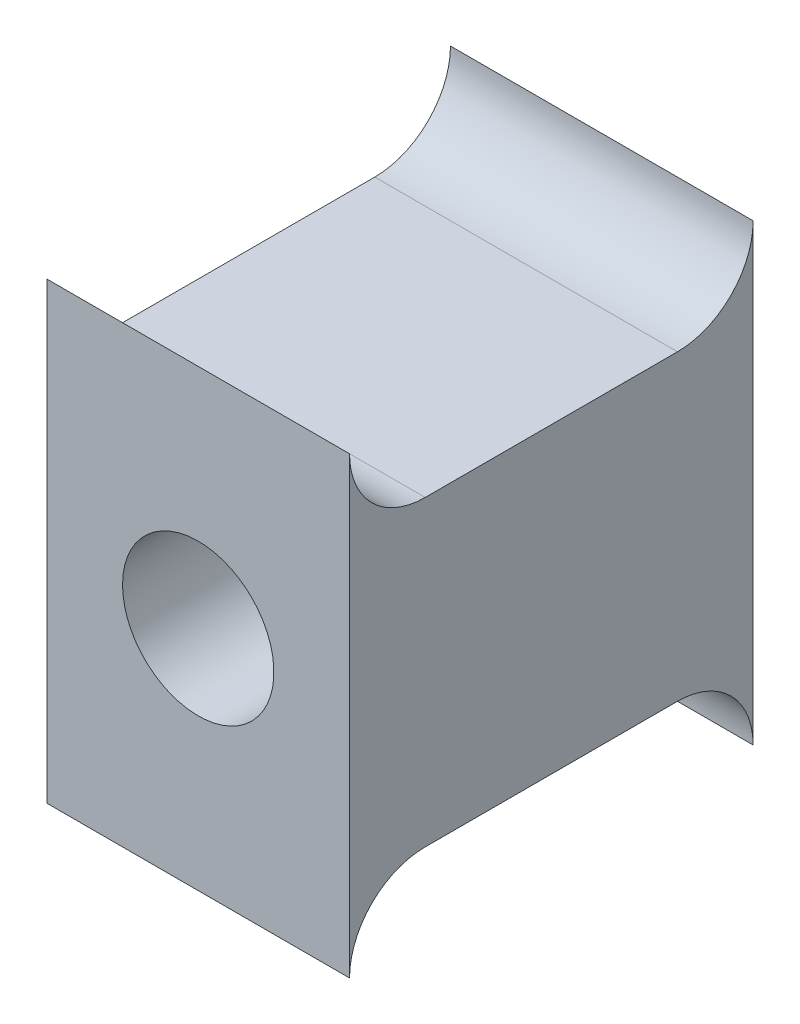
ISO-10303-21;
HEADER;
FILE_DESCRIPTION(('STEP AP214'),'2;1');
FILE_NAME('part.step','',(''),(''),'','','');
FILE_SCHEMA(('AUTOMOTIVE_DESIGN { 1 0 10303 214 1 1 1 1 }'));
ENDSEC;
DATA;
#1=APPLICATION_CONTEXT('core data for automotive mechanical design processes');
#2=APPLICATION_PROTOCOL_DEFINITION('international standard','automotive_design',2000,#1);
#3=PRODUCT_CONTEXT('',#1,'mechanical');
#4=PRODUCT('Part','Part','',(#3));
#5=PRODUCT_RELATED_PRODUCT_CATEGORY('part','',(#4));
#6=PRODUCT_DEFINITION_FORMATION('','',#4);
#7=PRODUCT_DEFINITION_CONTEXT('part definition',#1,'design');
#8=PRODUCT_DEFINITION('design','',#6,#7);
#9=PRODUCT_DEFINITION_SHAPE('','',#8);
#10=(LENGTH_UNIT() NAMED_UNIT(*) SI_UNIT(.MILLI.,.METRE.));
#11=(NAMED_UNIT(*) PLANE_ANGLE_UNIT() SI_UNIT($,.RADIAN.));
#12=(NAMED_UNIT(*) SI_UNIT($,.STERADIAN.) SOLID_ANGLE_UNIT());
#13=UNCERTAINTY_MEASURE_WITH_UNIT(LENGTH_MEASURE(1.E-05),#10,'distance_accuracy_value','');
#14=(GEOMETRIC_REPRESENTATION_CONTEXT(3) GLOBAL_UNCERTAINTY_ASSIGNED_CONTEXT((#13)) GLOBAL_UNIT_ASSIGNED_CONTEXT((#10,
#11,#12)) REPRESENTATION_CONTEXT('',''));
#15=CARTESIAN_POINT('',(0.,0.,0.));
#16=DIRECTION('',(0.,0.,1.));
#17=DIRECTION('',(1.,0.,0.));
#18=AXIS2_PLACEMENT_3D('',#15,#16,#17);
#19=CARTESIAN_POINT('',(12.7,-12.7,16.93418));
#20=DIRECTION('',(-1.,0.,0.));
#21=DIRECTION('',(0.,0.,1.));
#22=AXIS2_PLACEMENT_3D('',#19,#20,#21);
#23=PLANE('',#22);
#24=CARTESIAN_POINT('',(12.7,-19.05,-10.58418));
#25=DIRECTION('',(-1.,0.,0.));
#26=DIRECTION('',(0.,0.,1.));
#27=AXIS2_PLACEMENT_3D('',#24,#25,#26);
#28=CIRCLE('',#27,6.35);
#29=CARTESIAN_POINT('',(12.7,-12.7,-10.58418));
#30=VERTEX_POINT('',#29);
#31=CARTESIAN_POINT('',(12.7,-19.05,-16.93418));
#32=VERTEX_POINT('',#31);
#33=EDGE_CURVE('E121',#30,#32,#28,.T.);
#34=ORIENTED_EDGE('',*,*,#33,.T.);
#35=DIRECTION('',(0.,-1.,0.));
#36=VECTOR('',#35,1.);
#37=CARTESIAN_POINT('',(12.7,-12.7,-16.93418));
#38=LINE('',#37,#36);
#39=CARTESIAN_POINT('',(12.7,19.05,-16.93418));
#40=VERTEX_POINT('',#39);
#41=EDGE_CURVE('E100',#40,#32,#38,.T.);
#42=ORIENTED_EDGE('',*,*,#41,.F.);
#43=CARTESIAN_POINT('',(12.7,19.05,-10.58418));
#44=DIRECTION('',(-1.,0.,0.));
#45=DIRECTION('',(0.,0.,1.));
#46=AXIS2_PLACEMENT_3D('',#43,#44,#45);
#47=CIRCLE('',#46,6.35);
#48=CARTESIAN_POINT('',(12.7,12.7,-10.58418));
#49=VERTEX_POINT('',#48);
#50=EDGE_CURVE('E11',#40,#49,#47,.T.);
#51=ORIENTED_EDGE('',*,*,#50,.T.);
#52=DIRECTION('',(0.,0.,-1.));
#53=VECTOR('',#52,1.);
#54=CARTESIAN_POINT('',(12.7,12.7,16.93418));
#55=LINE('',#54,#53);
#56=CARTESIAN_POINT('',(12.7,12.7,10.58418));
#57=VERTEX_POINT('',#56);
#58=EDGE_CURVE('E139',#57,#49,#55,.T.);
#59=ORIENTED_EDGE('',*,*,#58,.F.);
#60=CARTESIAN_POINT('',(12.7,19.05,10.58418));
#61=DIRECTION('',(-1.,0.,0.));
#62=DIRECTION('',(0.,0.,1.));
#63=AXIS2_PLACEMENT_3D('',#60,#61,#62);
#64=CIRCLE('',#63,6.35);
#65=CARTESIAN_POINT('',(12.7,19.05,16.93418));
#66=VERTEX_POINT('',#65);
#67=EDGE_CURVE('E132',#57,#66,#64,.T.);
#68=ORIENTED_EDGE('',*,*,#67,.T.);
#69=DIRECTION('',(0.,1.,0.));
#70=VECTOR('',#69,1.);
#71=CARTESIAN_POINT('',(12.7,12.7,16.93418));
#72=LINE('',#71,#70);
#73=CARTESIAN_POINT('',(12.7,-19.05,16.93418));
#74=VERTEX_POINT('',#73);
#75=EDGE_CURVE('E137',#74,#66,#72,.T.);
#76=ORIENTED_EDGE('',*,*,#75,.F.);
#77=CARTESIAN_POINT('',(12.7,-19.05,10.58418));
#78=DIRECTION('',(-1.,0.,0.));
#79=DIRECTION('',(0.,0.,1.));
#80=AXIS2_PLACEMENT_3D('',#77,#78,#79);
#81=CIRCLE('',#80,6.35);
#82=CARTESIAN_POINT('',(12.7,-12.7,10.58418));
#83=VERTEX_POINT('',#82);
#84=EDGE_CURVE('E120',#74,#83,#81,.T.);
#85=ORIENTED_EDGE('',*,*,#84,.T.);
#86=DIRECTION('',(0.,0.,-1.));
#87=VECTOR('',#86,1.);
#88=CARTESIAN_POINT('',(12.7,-12.7,16.93418));
#89=LINE('',#88,#87);
#90=EDGE_CURVE('E148',#83,#30,#89,.T.);
#91=ORIENTED_EDGE('',*,*,#90,.T.);
#92=EDGE_LOOP('',(#34,#42,#51,#59,#68,#76,#85,#91));
#93=FACE_BOUND('',#92,.T.);
#94=ADVANCED_FACE('F31',(#93),#23,.F.);
#95=CARTESIAN_POINT('',(12.7,12.7,16.93418));
#96=DIRECTION('',(0.,-1.,0.));
#97=DIRECTION('',(0.,0.,-1.));
#98=AXIS2_PLACEMENT_3D('',#95,#96,#97);
#99=PLANE('',#98);
#100=DIRECTION('',(0.,0.,-1.));
#101=VECTOR('',#100,1.);
#102=CARTESIAN_POINT('',(-12.7,12.7,16.93418));
#103=LINE('',#102,#101);
#104=CARTESIAN_POINT('',(-12.7,12.7,10.58418));
#105=VERTEX_POINT('',#104);
#106=CARTESIAN_POINT('',(-12.7,12.7,-10.58418));
#107=VERTEX_POINT('',#106);
#108=EDGE_CURVE('E163',#105,#107,#103,.T.);
#109=ORIENTED_EDGE('',*,*,#108,.F.);
#110=DIRECTION('',(-1.,0.,0.));
#111=VECTOR('',#110,1.);
#112=CARTESIAN_POINT('',(12.7,12.7,10.58418));
#113=LINE('',#112,#111);
#114=EDGE_CURVE('E51',#105,#57,#113,.F.);
#115=ORIENTED_EDGE('',*,*,#114,.T.);
#116=ORIENTED_EDGE('',*,*,#58,.T.);
#117=DIRECTION('',(-1.,0.,0.));
#118=VECTOR('',#117,1.);
#119=CARTESIAN_POINT('',(12.7,12.7,-10.58418));
#120=LINE('',#119,#118);
#121=EDGE_CURVE('E167',#49,#107,#120,.T.);
#122=ORIENTED_EDGE('',*,*,#121,.T.);
#123=EDGE_LOOP('',(#109,#115,#116,#122));
#124=FACE_BOUND('',#123,.T.);
#125=ADVANCED_FACE('F173',(#124),#99,.F.);
#126=CARTESIAN_POINT('',(-12.7,-12.7,16.93418));
#127=DIRECTION('',(1.,0.,0.));
#128=DIRECTION('',(0.,0.,-1.));
#129=AXIS2_PLACEMENT_3D('',#126,#127,#128);
#130=PLANE('',#129);
#131=CARTESIAN_POINT('',(-12.7,19.05,-10.58418));
#132=DIRECTION('',(1.,0.,0.));
#133=DIRECTION('',(0.,0.,-1.));
#134=AXIS2_PLACEMENT_3D('',#131,#132,#133);
#135=CIRCLE('',#134,6.35);
#136=CARTESIAN_POINT('',(-12.7,19.05,-16.93418));
#137=VERTEX_POINT('',#136);
#138=EDGE_CURVE('E39',#107,#137,#135,.T.);
#139=ORIENTED_EDGE('',*,*,#138,.T.);
#140=DIRECTION('',(0.,-1.,0.));
#141=VECTOR('',#140,1.);
#142=CARTESIAN_POINT('',(-12.7,-19.05,-16.93418));
#143=LINE('',#142,#141);
#144=CARTESIAN_POINT('',(-12.7,-19.05,-16.93418));
#145=VERTEX_POINT('',#144);
#146=EDGE_CURVE('E98',#137,#145,#143,.T.);
#147=ORIENTED_EDGE('',*,*,#146,.T.);
#148=CARTESIAN_POINT('',(-12.7,-19.05,-10.58418));
#149=DIRECTION('',(1.,0.,0.));
#150=DIRECTION('',(0.,0.,-1.));
#151=AXIS2_PLACEMENT_3D('',#148,#149,#150);
#152=CIRCLE('',#151,6.35);
#153=CARTESIAN_POINT('',(-12.7,-12.7,-10.58418));
#154=VERTEX_POINT('',#153);
#155=EDGE_CURVE('E110',#145,#154,#152,.T.);
#156=ORIENTED_EDGE('',*,*,#155,.T.);
#157=DIRECTION('',(0.,0.,-1.));
#158=VECTOR('',#157,1.);
#159=CARTESIAN_POINT('',(-12.7,-12.7,16.93418));
#160=LINE('',#159,#158);
#161=CARTESIAN_POINT('',(-12.7,-12.7,10.58418));
#162=VERTEX_POINT('',#161);
#163=EDGE_CURVE('E160',#162,#154,#160,.T.);
#164=ORIENTED_EDGE('',*,*,#163,.F.);
#165=CARTESIAN_POINT('',(-12.7,-19.05,10.58418));
#166=DIRECTION('',(1.,0.,0.));
#167=DIRECTION('',(0.,0.,-1.));
#168=AXIS2_PLACEMENT_3D('',#165,#166,#167);
#169=CIRCLE('',#168,6.35);
#170=CARTESIAN_POINT('',(-12.7,-19.05,16.93418));
#171=VERTEX_POINT('',#170);
#172=EDGE_CURVE('E123',#162,#171,#169,.T.);
#173=ORIENTED_EDGE('',*,*,#172,.T.);
#174=DIRECTION('',(0.,1.,0.));
#175=VECTOR('',#174,1.);
#176=CARTESIAN_POINT('',(-12.7,-19.05,16.93418));
#177=LINE('',#176,#175);
#178=CARTESIAN_POINT('',(-12.7,19.05,16.93418));
#179=VERTEX_POINT('',#178);
#180=EDGE_CURVE('E175',#171,#179,#177,.T.);
#181=ORIENTED_EDGE('',*,*,#180,.T.);
#182=CARTESIAN_POINT('',(-12.7,19.05,10.58418));
#183=DIRECTION('',(1.,0.,0.));
#184=DIRECTION('',(0.,0.,-1.));
#185=AXIS2_PLACEMENT_3D('',#182,#183,#184);
#186=CIRCLE('',#185,6.35);
#187=EDGE_CURVE('E130',#179,#105,#186,.T.);
#188=ORIENTED_EDGE('',*,*,#187,.T.);
#189=ORIENTED_EDGE('',*,*,#108,.T.);
#190=EDGE_LOOP('',(#139,#147,#156,#164,#173,#181,#188,#189));
#191=FACE_BOUND('',#190,.T.);
#192=ADVANCED_FACE('F108',(#191),#130,.F.);
#193=CARTESIAN_POINT('',(12.7,-12.7,16.93418));
#194=DIRECTION('',(0.,1.,0.));
#195=DIRECTION('',(0.,0.,1.));
#196=AXIS2_PLACEMENT_3D('',#193,#194,#195);
#197=PLANE('',#196);
#198=ORIENTED_EDGE('',*,*,#163,.T.);
#199=DIRECTION('',(1.,0.,0.));
#200=VECTOR('',#199,1.);
#201=CARTESIAN_POINT('',(12.7,-12.7,-10.58418));
#202=LINE('',#201,#200);
#203=EDGE_CURVE('E119',#154,#30,#202,.T.);
#204=ORIENTED_EDGE('',*,*,#203,.T.);
#205=ORIENTED_EDGE('',*,*,#90,.F.);
#206=DIRECTION('',(1.,0.,0.));
#207=VECTOR('',#206,1.);
#208=CARTESIAN_POINT('',(12.7,-12.7,10.58418));
#209=LINE('',#208,#207);
#210=EDGE_CURVE('E164',#83,#162,#209,.F.);
#211=ORIENTED_EDGE('',*,*,#210,.T.);
#212=EDGE_LOOP('',(#198,#204,#205,#211));
#213=FACE_BOUND('',#212,.T.);
#214=ADVANCED_FACE('F213',(#213),#197,.F.);
#215=CARTESIAN_POINT('',(12.7,-19.05,-10.58418));
#216=DIRECTION('',(1.,0.,0.));
#217=DIRECTION('',(0.,0.,-1.));
#218=AXIS2_PLACEMENT_3D('',#215,#216,#217);
#219=CYLINDRICAL_SURFACE('',#218,6.35);
#220=ORIENTED_EDGE('',*,*,#155,.F.);
#221=DIRECTION('',(1.,0.,0.));
#222=VECTOR('',#221,1.);
#223=CARTESIAN_POINT('',(-51.0713331996042,-19.05,-16.93418));
#224=LINE('',#223,#222);
#225=EDGE_CURVE('E95',#145,#32,#224,.T.);
#226=ORIENTED_EDGE('',*,*,#225,.T.);
#227=ORIENTED_EDGE('',*,*,#33,.F.);
#228=ORIENTED_EDGE('',*,*,#203,.F.);
#229=EDGE_LOOP('',(#220,#226,#227,#228));
#230=FACE_BOUND('',#229,.T.);
#231=ADVANCED_FACE('F117',(#230),#219,.F.);
#232=CARTESIAN_POINT('',(-51.0713331996042,-19.05,10.58418));
#233=DIRECTION('',(1.,0.,0.));
#234=DIRECTION('',(0.,0.,-1.));
#235=AXIS2_PLACEMENT_3D('',#232,#233,#234);
#236=CYLINDRICAL_SURFACE('',#235,6.35);
#237=ORIENTED_EDGE('',*,*,#172,.F.);
#238=ORIENTED_EDGE('',*,*,#210,.F.);
#239=ORIENTED_EDGE('',*,*,#84,.F.);
#240=DIRECTION('',(1.,0.,0.));
#241=VECTOR('',#240,1.);
#242=CARTESIAN_POINT('',(-51.0713331996042,-19.05,16.93418));
#243=LINE('',#242,#241);
#244=EDGE_CURVE('E146',#171,#74,#243,.T.);
#245=ORIENTED_EDGE('',*,*,#244,.F.);
#246=EDGE_LOOP('',(#237,#238,#239,#245));
#247=FACE_BOUND('',#246,.T.);
#248=ADVANCED_FACE('F212',(#247),#236,.F.);
#249=CARTESIAN_POINT('',(-51.0713331996042,19.05,10.58418));
#250=DIRECTION('',(-1.,0.,0.));
#251=DIRECTION('',(0.,0.,1.));
#252=AXIS2_PLACEMENT_3D('',#249,#250,#251);
#253=CYLINDRICAL_SURFACE('',#252,6.35);
#254=ORIENTED_EDGE('',*,*,#67,.F.);
#255=ORIENTED_EDGE('',*,*,#114,.F.);
#256=ORIENTED_EDGE('',*,*,#187,.F.);
#257=DIRECTION('',(1.,0.,0.));
#258=VECTOR('',#257,1.);
#259=CARTESIAN_POINT('',(-51.0713331996042,19.05,16.93418));
#260=LINE('',#259,#258);
#261=EDGE_CURVE('E142',#179,#66,#260,.T.);
#262=ORIENTED_EDGE('',*,*,#261,.T.);
#263=EDGE_LOOP('',(#254,#255,#256,#262));
#264=FACE_BOUND('',#263,.T.);
#265=ADVANCED_FACE('F143',(#264),#253,.F.);
#266=CARTESIAN_POINT('',(12.7,19.05,-10.58418));
#267=DIRECTION('',(-1.,0.,0.));
#268=DIRECTION('',(0.,0.,1.));
#269=AXIS2_PLACEMENT_3D('',#266,#267,#268);
#270=CYLINDRICAL_SURFACE('',#269,6.35);
#271=ORIENTED_EDGE('',*,*,#50,.F.);
#272=DIRECTION('',(1.,0.,0.));
#273=VECTOR('',#272,1.);
#274=CARTESIAN_POINT('',(-51.0713331996042,19.05,-16.93418));
#275=LINE('',#274,#273);
#276=EDGE_CURVE('E104',#137,#40,#275,.T.);
#277=ORIENTED_EDGE('',*,*,#276,.F.);
#278=ORIENTED_EDGE('',*,*,#138,.F.);
#279=ORIENTED_EDGE('',*,*,#121,.F.);
#280=EDGE_LOOP('',(#271,#277,#278,#279));
#281=FACE_BOUND('',#280,.T.);
#282=ADVANCED_FACE('F33',(#281),#270,.F.);
#283=CARTESIAN_POINT('',(-12.7,12.7,16.93418));
#284=DIRECTION('',(0.,0.,-1.));
#285=DIRECTION('',(-1.,0.,0.));
#286=AXIS2_PLACEMENT_3D('',#283,#284,#285);
#287=PLANE('',#286);
#288=CARTESIAN_POINT('',(0.,0.,16.93418));
#289=DIRECTION('',(0.,0.,-1.));
#290=DIRECTION('',(-1.,0.,0.));
#291=AXIS2_PLACEMENT_3D('',#288,#289,#290);
#292=CIRCLE('',#291,6.35);
#293=CARTESIAN_POINT('',(-6.35,0.,16.93418));
#294=VERTEX_POINT('',#293);
#295=EDGE_CURVE('E105',#294,#294,#292,.T.);
#296=ORIENTED_EDGE('',*,*,#295,.T.);
#297=EDGE_LOOP('',(#296));
#298=FACE_BOUND('',#297,.T.);
#299=ORIENTED_EDGE('',*,*,#75,.T.);
#300=ORIENTED_EDGE('',*,*,#261,.F.);
#301=ORIENTED_EDGE('',*,*,#180,.F.);
#302=ORIENTED_EDGE('',*,*,#244,.T.);
#303=EDGE_LOOP('',(#299,#300,#301,#302));
#304=FACE_BOUND('',#303,.T.);
#305=ADVANCED_FACE('F190',(#298,#304),#287,.F.);
#306=CARTESIAN_POINT('',(0.,0.,16.93418));
#307=DIRECTION('',(0.,0.,-1.));
#308=DIRECTION('',(-1.,0.,0.));
#309=AXIS2_PLACEMENT_3D('',#306,#307,#308);
#310=CYLINDRICAL_SURFACE('',#309,6.35);
#311=ORIENTED_EDGE('',*,*,#295,.F.);
#312=EDGE_LOOP('',(#311));
#313=FACE_BOUND('',#312,.T.);
#314=CARTESIAN_POINT('',(0.,0.,-16.93418));
#315=DIRECTION('',(0.,0.,1.));
#316=DIRECTION('',(1.,0.,0.));
#317=AXIS2_PLACEMENT_3D('',#314,#315,#316);
#318=CIRCLE('',#317,6.35);
#319=CARTESIAN_POINT('',(6.35,0.,-16.93418));
#320=VERTEX_POINT('',#319);
#321=EDGE_CURVE('E114',#320,#320,#318,.T.);
#322=ORIENTED_EDGE('',*,*,#321,.F.);
#323=EDGE_LOOP('',(#322));
#324=FACE_BOUND('',#323,.T.);
#325=ADVANCED_FACE('F188',(#313,#324),#310,.F.);
#326=CARTESIAN_POINT('',(-12.7,-12.7,-16.93418));
#327=DIRECTION('',(0.,0.,1.));
#328=DIRECTION('',(1.,0.,0.));
#329=AXIS2_PLACEMENT_3D('',#326,#327,#328);
#330=PLANE('',#329);
#331=ORIENTED_EDGE('',*,*,#321,.T.);
#332=EDGE_LOOP('',(#331));
#333=FACE_BOUND('',#332,.T.);
#334=ORIENTED_EDGE('',*,*,#41,.T.);
#335=ORIENTED_EDGE('',*,*,#225,.F.);
#336=ORIENTED_EDGE('',*,*,#146,.F.);
#337=ORIENTED_EDGE('',*,*,#276,.T.);
#338=EDGE_LOOP('',(#334,#335,#336,#337));
#339=FACE_BOUND('',#338,.T.);
#340=ADVANCED_FACE('F97',(#333,#339),#330,.F.);
#341=CLOSED_SHELL('',(#94,#125,#192,#214,#231,#248,#265,#282,#305,#325,#340));
#342=MANIFOLD_SOLID_BREP('B2',#341);
#343=ADVANCED_BREP_SHAPE_REPRESENTATION('',(#18,#342),#14);
#344=SHAPE_DEFINITION_REPRESENTATION(#9,#343);
ENDSEC;
END-ISO-10303-21;
